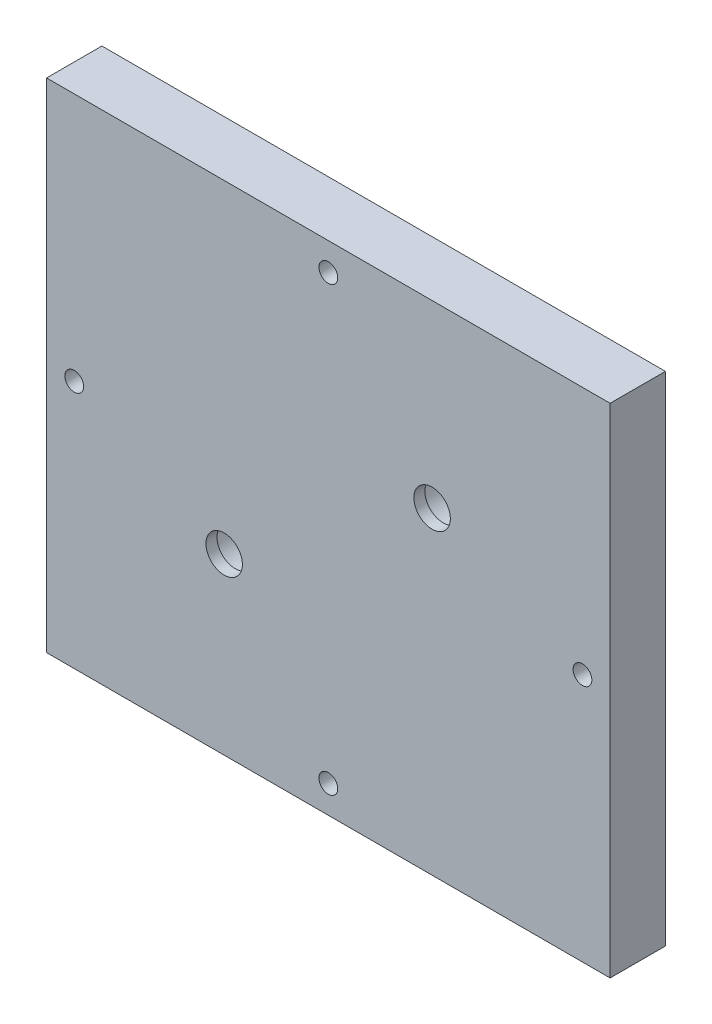
ISO-10303-21;
HEADER;
FILE_DESCRIPTION(('STEP AP214'),'2;1');
FILE_NAME('part.step','',(''),(''),'','','');
FILE_SCHEMA(('AUTOMOTIVE_DESIGN { 1 0 10303 214 1 1 1 1 }'));
ENDSEC;
DATA;
#1=APPLICATION_CONTEXT('core data for automotive mechanical design processes');
#2=APPLICATION_PROTOCOL_DEFINITION('international standard','automotive_design',2000,#1);
#3=PRODUCT_CONTEXT('',#1,'mechanical');
#4=PRODUCT('Part','Part','',(#3));
#5=PRODUCT_RELATED_PRODUCT_CATEGORY('part','',(#4));
#6=PRODUCT_DEFINITION_FORMATION('','',#4);
#7=PRODUCT_DEFINITION_CONTEXT('part definition',#1,'design');
#8=PRODUCT_DEFINITION('design','',#6,#7);
#9=PRODUCT_DEFINITION_SHAPE('','',#8);
#10=(LENGTH_UNIT() NAMED_UNIT(*) SI_UNIT(.MILLI.,.METRE.));
#11=(NAMED_UNIT(*) PLANE_ANGLE_UNIT() SI_UNIT($,.RADIAN.));
#12=(NAMED_UNIT(*) SI_UNIT($,.STERADIAN.) SOLID_ANGLE_UNIT());
#13=UNCERTAINTY_MEASURE_WITH_UNIT(LENGTH_MEASURE(1.E-05),#10,'distance_accuracy_value','');
#14=(GEOMETRIC_REPRESENTATION_CONTEXT(3) GLOBAL_UNCERTAINTY_ASSIGNED_CONTEXT((#13)) GLOBAL_UNIT_ASSIGNED_CONTEXT((#10,
#11,#12)) REPRESENTATION_CONTEXT('',''));
#15=CARTESIAN_POINT('',(0.,0.,0.));
#16=DIRECTION('',(0.,0.,1.));
#17=DIRECTION('',(1.,0.,0.));
#18=AXIS2_PLACEMENT_3D('',#15,#16,#17);
#19=CARTESIAN_POINT('',(45.9632415614786,58.8506318262794,-13.3350359577631));
#20=DIRECTION('',(-1.,0.,0.));
#21=DIRECTION('',(0.,-1.,0.));
#22=AXIS2_PLACEMENT_3D('',#19,#20,#21);
#23=PLANE('',#22);
#24=DIRECTION('',(0.,1.,0.));
#25=VECTOR('',#24,1.);
#26=CARTESIAN_POINT('',(45.9632415614786,58.8506318262794,-23.3350359577631));
#27=LINE('',#26,#25);
#28=CARTESIAN_POINT('',(45.9632415614786,-31.1493681737206,-23.3350359577631));
#29=VERTEX_POINT('',#28);
#30=CARTESIAN_POINT('',(45.9632415614786,58.8506318262794,-23.3350359577631));
#31=VERTEX_POINT('',#30);
#32=EDGE_CURVE('E94',#29,#31,#27,.T.);
#33=ORIENTED_EDGE('',*,*,#32,.T.);
#34=DIRECTION('',(0.,0.,-1.));
#35=VECTOR('',#34,1.);
#36=CARTESIAN_POINT('',(45.9632415614786,58.8506318262794,-13.3350359577631));
#37=LINE('',#36,#35);
#38=CARTESIAN_POINT('',(45.9632415614786,58.8506318262794,-13.3350359577631));
#39=VERTEX_POINT('',#38);
#40=EDGE_CURVE('E11',#39,#31,#37,.T.);
#41=ORIENTED_EDGE('',*,*,#40,.F.);
#42=DIRECTION('',(0.,1.,0.));
#43=VECTOR('',#42,1.);
#44=CARTESIAN_POINT('',(45.9632415614786,58.8506318262794,-13.3350359577631));
#45=LINE('',#44,#43);
#46=CARTESIAN_POINT('',(45.9632415614786,-31.1493681737206,-13.3350359577631));
#47=VERTEX_POINT('',#46);
#48=EDGE_CURVE('E82',#47,#39,#45,.T.);
#49=ORIENTED_EDGE('',*,*,#48,.F.);
#50=DIRECTION('',(0.,0.,-1.));
#51=VECTOR('',#50,1.);
#52=CARTESIAN_POINT('',(45.9632415614786,-31.1493681737206,-13.3350359577631));
#53=LINE('',#52,#51);
#54=EDGE_CURVE('E90',#47,#29,#53,.T.);
#55=ORIENTED_EDGE('',*,*,#54,.T.);
#56=EDGE_LOOP('',(#33,#41,#49,#55));
#57=FACE_BOUND('',#56,.T.);
#58=ADVANCED_FACE('F31',(#57),#23,.F.);
#59=CARTESIAN_POINT('',(45.9632415614786,58.8506318262794,-13.3350359577631));
#60=DIRECTION('',(0.,-1.,0.));
#61=DIRECTION('',(1.,0.,0.));
#62=AXIS2_PLACEMENT_3D('',#59,#60,#61);
#63=PLANE('',#62);
#64=DIRECTION('',(-1.,0.,0.));
#65=VECTOR('',#64,1.);
#66=CARTESIAN_POINT('',(45.9632415614786,58.8506318262794,-23.3350359577631));
#67=LINE('',#66,#65);
#68=CARTESIAN_POINT('',(-55.9367584385214,58.8506318262794,-23.3350359577631));
#69=VERTEX_POINT('',#68);
#70=EDGE_CURVE('E86',#31,#69,#67,.T.);
#71=ORIENTED_EDGE('',*,*,#70,.T.);
#72=DIRECTION('',(0.,0.,-1.));
#73=VECTOR('',#72,1.);
#74=CARTESIAN_POINT('',(-55.9367584385214,58.8506318262794,-13.3350359577631));
#75=LINE('',#74,#73);
#76=CARTESIAN_POINT('',(-55.9367584385214,58.8506318262794,-13.3350359577631));
#77=VERTEX_POINT('',#76);
#78=EDGE_CURVE('E39',#77,#69,#75,.T.);
#79=ORIENTED_EDGE('',*,*,#78,.F.);
#80=DIRECTION('',(-1.,0.,0.));
#81=VECTOR('',#80,1.);
#82=CARTESIAN_POINT('',(45.9632415614786,58.8506318262794,-13.3350359577631));
#83=LINE('',#82,#81);
#84=EDGE_CURVE('E77',#39,#77,#83,.T.);
#85=ORIENTED_EDGE('',*,*,#84,.F.);
#86=ORIENTED_EDGE('',*,*,#40,.T.);
#87=EDGE_LOOP('',(#71,#79,#85,#86));
#88=FACE_BOUND('',#87,.T.);
#89=ADVANCED_FACE('F85',(#88),#63,.F.);
#90=CARTESIAN_POINT('',(-55.9367584385214,58.8506318262794,-13.3350359577631));
#91=DIRECTION('',(1.,0.,0.));
#92=DIRECTION('',(0.,1.,0.));
#93=AXIS2_PLACEMENT_3D('',#90,#91,#92);
#94=PLANE('',#93);
#95=DIRECTION('',(0.,-1.,0.));
#96=VECTOR('',#95,1.);
#97=CARTESIAN_POINT('',(-55.9367584385214,58.8506318262794,-23.3350359577631));
#98=LINE('',#97,#96);
#99=CARTESIAN_POINT('',(-55.9367584385214,-31.1493681737206,-23.3350359577631));
#100=VERTEX_POINT('',#99);
#101=EDGE_CURVE('E64',#69,#100,#98,.T.);
#102=ORIENTED_EDGE('',*,*,#101,.T.);
#103=DIRECTION('',(0.,0.,-1.));
#104=VECTOR('',#103,1.);
#105=CARTESIAN_POINT('',(-55.9367584385214,-31.1493681737206,-13.3350359577631));
#106=LINE('',#105,#104);
#107=CARTESIAN_POINT('',(-55.9367584385214,-31.1493681737206,-13.3350359577631));
#108=VERTEX_POINT('',#107);
#109=EDGE_CURVE('E87',#108,#100,#106,.T.);
#110=ORIENTED_EDGE('',*,*,#109,.F.);
#111=DIRECTION('',(0.,-1.,0.));
#112=VECTOR('',#111,1.);
#113=CARTESIAN_POINT('',(-55.9367584385214,58.8506318262794,-13.3350359577631));
#114=LINE('',#113,#112);
#115=EDGE_CURVE('E80',#77,#108,#114,.T.);
#116=ORIENTED_EDGE('',*,*,#115,.F.);
#117=ORIENTED_EDGE('',*,*,#78,.T.);
#118=EDGE_LOOP('',(#102,#110,#116,#117));
#119=FACE_BOUND('',#118,.T.);
#120=ADVANCED_FACE('F88',(#119),#94,.F.);
#121=CARTESIAN_POINT('',(45.9632415614786,-31.1493681737206,-13.3350359577631));
#122=DIRECTION('',(0.,1.,0.));
#123=DIRECTION('',(-1.,0.,0.));
#124=AXIS2_PLACEMENT_3D('',#121,#122,#123);
#125=PLANE('',#124);
#126=DIRECTION('',(1.,0.,0.));
#127=VECTOR('',#126,1.);
#128=CARTESIAN_POINT('',(45.9632415614786,-31.1493681737206,-23.3350359577631));
#129=LINE('',#128,#127);
#130=EDGE_CURVE('E70',#100,#29,#129,.T.);
#131=ORIENTED_EDGE('',*,*,#130,.T.);
#132=ORIENTED_EDGE('',*,*,#54,.F.);
#133=DIRECTION('',(1.,0.,0.));
#134=VECTOR('',#133,1.);
#135=CARTESIAN_POINT('',(45.9632415614786,-31.1493681737206,-13.3350359577631));
#136=LINE('',#135,#134);
#137=EDGE_CURVE('E47',#108,#47,#136,.T.);
#138=ORIENTED_EDGE('',*,*,#137,.F.);
#139=ORIENTED_EDGE('',*,*,#109,.T.);
#140=EDGE_LOOP('',(#131,#132,#138,#139));
#141=FACE_BOUND('',#140,.T.);
#142=ADVANCED_FACE('F102',(#141),#125,.F.);
#143=CARTESIAN_POINT('',(45.9632415614786,-31.1493681737206,-13.3350359577631));
#144=DIRECTION('',(0.,0.,-1.));
#145=DIRECTION('',(-1.,0.,0.));
#146=AXIS2_PLACEMENT_3D('',#143,#144,#145);
#147=PLANE('',#146);
#148=CARTESIAN_POINT('',(13.7732415614786,26.3306318262794,-13.3350359577631));
#149=DIRECTION('',(0.,0.,-1.));
#150=DIRECTION('',(-1.,0.,0.));
#151=AXIS2_PLACEMENT_3D('',#148,#149,#150);
#152=CIRCLE('',#151,3.29999999999999);
#153=CARTESIAN_POINT('',(10.4732415614786,26.3306318262794,-13.3350359577631));
#154=VERTEX_POINT('',#153);
#155=EDGE_CURVE('E149',#154,#154,#152,.T.);
#156=ORIENTED_EDGE('',*,*,#155,.T.);
#157=EDGE_LOOP('',(#156));
#158=FACE_BOUND('',#157,.T.);
#159=CARTESIAN_POINT('',(-23.8267584385214,0.350631826279403,-13.3350359577631));
#160=DIRECTION('',(0.,0.,-1.));
#161=DIRECTION('',(-1.,0.,0.));
#162=AXIS2_PLACEMENT_3D('',#159,#160,#161);
#163=CIRCLE('',#162,3.29999999999999);
#164=CARTESIAN_POINT('',(-27.1267584385214,0.350631826279403,-13.3350359577631));
#165=VERTEX_POINT('',#164);
#166=EDGE_CURVE('E141',#165,#165,#163,.T.);
#167=ORIENTED_EDGE('',*,*,#166,.T.);
#168=EDGE_LOOP('',(#167));
#169=FACE_BOUND('',#168,.T.);
#170=CARTESIAN_POINT('',(40.9632415614786,13.8506318262794,-13.3350359577631));
#171=DIRECTION('',(0.,0.,-1.));
#172=DIRECTION('',(-1.,0.,0.));
#173=AXIS2_PLACEMENT_3D('',#170,#171,#172);
#174=CIRCLE('',#173,1.69999999999999);
#175=CARTESIAN_POINT('',(39.2632415614786,13.8506318262794,-13.3350359577631));
#176=VERTEX_POINT('',#175);
#177=EDGE_CURVE('E125',#176,#176,#174,.T.);
#178=ORIENTED_EDGE('',*,*,#177,.T.);
#179=EDGE_LOOP('',(#178));
#180=FACE_BOUND('',#179,.T.);
#181=CARTESIAN_POINT('',(-4.98675843852144,53.8506318262794,-13.3350359577631));
#182=DIRECTION('',(0.,0.,-1.));
#183=DIRECTION('',(-1.,0.,0.));
#184=AXIS2_PLACEMENT_3D('',#181,#182,#183);
#185=CIRCLE('',#184,1.69999999999999);
#186=CARTESIAN_POINT('',(-6.68675843852143,53.8506318262794,-13.3350359577631));
#187=VERTEX_POINT('',#186);
#188=EDGE_CURVE('E119',#187,#187,#185,.T.);
#189=ORIENTED_EDGE('',*,*,#188,.T.);
#190=EDGE_LOOP('',(#189));
#191=FACE_BOUND('',#190,.T.);
#192=CARTESIAN_POINT('',(-50.9367584385215,13.8506318262794,-13.3350359577631));
#193=DIRECTION('',(0.,0.,-1.));
#194=DIRECTION('',(-1.,0.,0.));
#195=AXIS2_PLACEMENT_3D('',#192,#193,#194);
#196=CIRCLE('',#195,1.69999999999999);
#197=CARTESIAN_POINT('',(-52.6367584385214,13.8506318262794,-13.3350359577631));
#198=VERTEX_POINT('',#197);
#199=EDGE_CURVE('E113',#198,#198,#196,.T.);
#200=ORIENTED_EDGE('',*,*,#199,.T.);
#201=EDGE_LOOP('',(#200));
#202=FACE_BOUND('',#201,.T.);
#203=CARTESIAN_POINT('',(-4.98675843852144,-26.1493681737206,-13.3350359577631));
#204=DIRECTION('',(0.,0.,-1.));
#205=DIRECTION('',(-1.,0.,0.));
#206=AXIS2_PLACEMENT_3D('',#203,#204,#205);
#207=CIRCLE('',#206,1.69999999999999);
#208=CARTESIAN_POINT('',(-6.68675843852143,-26.1493681737206,-13.3350359577631));
#209=VERTEX_POINT('',#208);
#210=EDGE_CURVE('E97',#209,#209,#207,.T.);
#211=ORIENTED_EDGE('',*,*,#210,.T.);
#212=EDGE_LOOP('',(#211));
#213=FACE_BOUND('',#212,.T.);
#214=ORIENTED_EDGE('',*,*,#48,.T.);
#215=ORIENTED_EDGE('',*,*,#84,.T.);
#216=ORIENTED_EDGE('',*,*,#115,.T.);
#217=ORIENTED_EDGE('',*,*,#137,.T.);
#218=EDGE_LOOP('',(#214,#215,#216,#217));
#219=FACE_BOUND('',#218,.T.);
#220=ADVANCED_FACE('F78',(#158,#169,#180,#191,#202,#213,#219),#147,.F.);
#221=CARTESIAN_POINT('',(45.9632415614786,-31.1493681737206,-23.3350359577631));
#222=DIRECTION('',(0.,0.,-1.));
#223=DIRECTION('',(-1.,0.,0.));
#224=AXIS2_PLACEMENT_3D('',#221,#222,#223);
#225=PLANE('',#224);
#226=CARTESIAN_POINT('',(-23.8267584385214,0.350631826279403,-23.3350359577631));
#227=DIRECTION('',(0.,0.,-1.));
#228=DIRECTION('',(-1.,0.,0.));
#229=AXIS2_PLACEMENT_3D('',#226,#227,#228);
#230=CIRCLE('',#229,4.99999999999631);
#231=CARTESIAN_POINT('',(-28.8267584385177,0.350631826279403,-23.3350359577631));
#232=VERTEX_POINT('',#231);
#233=EDGE_CURVE('E138',#232,#232,#230,.T.);
#234=ORIENTED_EDGE('',*,*,#233,.F.);
#235=EDGE_LOOP('',(#234));
#236=FACE_BOUND('',#235,.T.);
#237=CARTESIAN_POINT('',(13.7732415614786,26.3306318262794,-23.3350359577631));
#238=DIRECTION('',(0.,0.,-1.));
#239=DIRECTION('',(-1.,0.,0.));
#240=AXIS2_PLACEMENT_3D('',#237,#238,#239);
#241=CIRCLE('',#240,4.9999999999963);
#242=CARTESIAN_POINT('',(8.77324156148228,26.3306318262794,-23.3350359577631));
#243=VERTEX_POINT('',#242);
#244=EDGE_CURVE('E132',#243,#243,#241,.T.);
#245=ORIENTED_EDGE('',*,*,#244,.F.);
#246=EDGE_LOOP('',(#245));
#247=FACE_BOUND('',#246,.T.);
#248=CARTESIAN_POINT('',(40.9632415614786,13.8506318262794,-23.3350359577631));
#249=DIRECTION('',(0.,0.,-1.));
#250=DIRECTION('',(-1.,0.,0.));
#251=AXIS2_PLACEMENT_3D('',#248,#249,#250);
#252=CIRCLE('',#251,1.69999999999999);
#253=CARTESIAN_POINT('',(39.2632415614786,13.8506318262794,-23.3350359577631));
#254=VERTEX_POINT('',#253);
#255=EDGE_CURVE('E128',#254,#254,#252,.T.);
#256=ORIENTED_EDGE('',*,*,#255,.F.);
#257=EDGE_LOOP('',(#256));
#258=FACE_BOUND('',#257,.T.);
#259=CARTESIAN_POINT('',(-4.98675843852144,53.8506318262794,-23.3350359577631));
#260=DIRECTION('',(0.,0.,-1.));
#261=DIRECTION('',(-1.,0.,0.));
#262=AXIS2_PLACEMENT_3D('',#259,#260,#261);
#263=CIRCLE('',#262,1.69999999999999);
#264=CARTESIAN_POINT('',(-6.68675843852142,53.8506318262794,-23.3350359577631));
#265=VERTEX_POINT('',#264);
#266=EDGE_CURVE('E122',#265,#265,#263,.T.);
#267=ORIENTED_EDGE('',*,*,#266,.F.);
#268=EDGE_LOOP('',(#267));
#269=FACE_BOUND('',#268,.T.);
#270=CARTESIAN_POINT('',(-50.9367584385215,13.8506318262794,-23.3350359577631));
#271=DIRECTION('',(0.,0.,-1.));
#272=DIRECTION('',(-1.,0.,0.));
#273=AXIS2_PLACEMENT_3D('',#270,#271,#272);
#274=CIRCLE('',#273,1.69999999999999);
#275=CARTESIAN_POINT('',(-52.6367584385214,13.8506318262794,-23.3350359577631));
#276=VERTEX_POINT('',#275);
#277=EDGE_CURVE('E116',#276,#276,#274,.T.);
#278=ORIENTED_EDGE('',*,*,#277,.F.);
#279=EDGE_LOOP('',(#278));
#280=FACE_BOUND('',#279,.T.);
#281=CARTESIAN_POINT('',(-4.98675843852144,-26.1493681737206,-23.3350359577631));
#282=DIRECTION('',(0.,0.,-1.));
#283=DIRECTION('',(-1.,0.,0.));
#284=AXIS2_PLACEMENT_3D('',#281,#282,#283);
#285=CIRCLE('',#284,1.69999999999999);
#286=CARTESIAN_POINT('',(-6.68675843852142,-26.1493681737206,-23.3350359577631));
#287=VERTEX_POINT('',#286);
#288=EDGE_CURVE('E110',#287,#287,#285,.T.);
#289=ORIENTED_EDGE('',*,*,#288,.F.);
#290=EDGE_LOOP('',(#289));
#291=FACE_BOUND('',#290,.T.);
#292=ORIENTED_EDGE('',*,*,#32,.F.);
#293=ORIENTED_EDGE('',*,*,#130,.F.);
#294=ORIENTED_EDGE('',*,*,#101,.F.);
#295=ORIENTED_EDGE('',*,*,#70,.F.);
#296=EDGE_LOOP('',(#292,#293,#294,#295));
#297=FACE_BOUND('',#296,.T.);
#298=ADVANCED_FACE('F105',(#236,#247,#258,#269,#280,#291,#297),#225,.T.);
#299=CARTESIAN_POINT('',(-4.98675843852144,-26.1493681737206,-23.3350359577631));
#300=DIRECTION('',(0.,0.,-1.));
#301=DIRECTION('',(-1.,0.,0.));
#302=AXIS2_PLACEMENT_3D('',#299,#300,#301);
#303=CYLINDRICAL_SURFACE('',#302,1.69999999999999);
#304=ORIENTED_EDGE('',*,*,#210,.F.);
#305=EDGE_LOOP('',(#304));
#306=FACE_BOUND('',#305,.T.);
#307=ORIENTED_EDGE('',*,*,#288,.T.);
#308=EDGE_LOOP('',(#307));
#309=FACE_BOUND('',#308,.T.);
#310=ADVANCED_FACE('F174',(#306,#309),#303,.F.);
#311=CARTESIAN_POINT('',(-50.9367584385215,13.8506318262794,-23.3350359577631));
#312=DIRECTION('',(0.,0.,-1.));
#313=DIRECTION('',(-1.,0.,0.));
#314=AXIS2_PLACEMENT_3D('',#311,#312,#313);
#315=CYLINDRICAL_SURFACE('',#314,1.69999999999999);
#316=ORIENTED_EDGE('',*,*,#199,.F.);
#317=EDGE_LOOP('',(#316));
#318=FACE_BOUND('',#317,.T.);
#319=ORIENTED_EDGE('',*,*,#277,.T.);
#320=EDGE_LOOP('',(#319));
#321=FACE_BOUND('',#320,.T.);
#322=ADVANCED_FACE('F186',(#318,#321),#315,.F.);
#323=CARTESIAN_POINT('',(-4.98675843852144,53.8506318262794,-23.3350359577631));
#324=DIRECTION('',(0.,0.,-1.));
#325=DIRECTION('',(-1.,0.,0.));
#326=AXIS2_PLACEMENT_3D('',#323,#324,#325);
#327=CYLINDRICAL_SURFACE('',#326,1.69999999999999);
#328=ORIENTED_EDGE('',*,*,#188,.F.);
#329=EDGE_LOOP('',(#328));
#330=FACE_BOUND('',#329,.T.);
#331=ORIENTED_EDGE('',*,*,#266,.T.);
#332=EDGE_LOOP('',(#331));
#333=FACE_BOUND('',#332,.T.);
#334=ADVANCED_FACE('F192',(#330,#333),#327,.F.);
#335=CARTESIAN_POINT('',(40.9632415614786,13.8506318262794,-23.3350359577631));
#336=DIRECTION('',(0.,0.,-1.));
#337=DIRECTION('',(-1.,0.,0.));
#338=AXIS2_PLACEMENT_3D('',#335,#336,#337);
#339=CYLINDRICAL_SURFACE('',#338,1.69999999999999);
#340=ORIENTED_EDGE('',*,*,#177,.F.);
#341=EDGE_LOOP('',(#340));
#342=FACE_BOUND('',#341,.T.);
#343=ORIENTED_EDGE('',*,*,#255,.T.);
#344=EDGE_LOOP('',(#343));
#345=FACE_BOUND('',#344,.T.);
#346=ADVANCED_FACE('F168',(#342,#345),#339,.F.);
#347=CARTESIAN_POINT('',(13.7732415614786,26.3306318262794,-15.3350359577631));
#348=DIRECTION('',(0.,0.,-1.));
#349=DIRECTION('',(-1.,0.,0.));
#350=AXIS2_PLACEMENT_3D('',#347,#348,#349);
#351=CYLINDRICAL_SURFACE('',#350,4.9999999999963);
#352=CARTESIAN_POINT('',(13.7732415614786,26.3306318262794,-15.3350359577631));
#353=DIRECTION('',(0.,0.,-1.));
#354=DIRECTION('',(-1.,0.,0.));
#355=AXIS2_PLACEMENT_3D('',#352,#353,#354);
#356=CIRCLE('',#355,4.9999999999963);
#357=CARTESIAN_POINT('',(8.77324156148228,26.3306318262794,-15.3350359577631));
#358=VERTEX_POINT('',#357);
#359=EDGE_CURVE('E131',#358,#358,#356,.T.);
#360=ORIENTED_EDGE('',*,*,#359,.F.);
#361=EDGE_LOOP('',(#360));
#362=FACE_BOUND('',#361,.T.);
#363=ORIENTED_EDGE('',*,*,#244,.T.);
#364=EDGE_LOOP('',(#363));
#365=FACE_BOUND('',#364,.T.);
#366=ADVANCED_FACE('F162',(#362,#365),#351,.F.);
#367=CARTESIAN_POINT('',(13.7732415614786,26.3306318262794,-15.3350359577631));
#368=DIRECTION('',(0.,0.,-1.));
#369=DIRECTION('',(-1.,0.,0.));
#370=AXIS2_PLACEMENT_3D('',#367,#368,#369);
#371=PLANE('',#370);
#372=CARTESIAN_POINT('',(13.7732415614786,26.3306318262794,-15.3350359577631));
#373=DIRECTION('',(0.,0.,-1.));
#374=DIRECTION('',(-1.,0.,0.));
#375=AXIS2_PLACEMENT_3D('',#372,#373,#374);
#376=CIRCLE('',#375,3.29999999999999);
#377=CARTESIAN_POINT('',(10.4732415614786,26.3306318262794,-15.3350359577631));
#378=VERTEX_POINT('',#377);
#379=EDGE_CURVE('E152',#378,#378,#376,.T.);
#380=ORIENTED_EDGE('',*,*,#379,.F.);
#381=EDGE_LOOP('',(#380));
#382=FACE_BOUND('',#381,.T.);
#383=ORIENTED_EDGE('',*,*,#359,.T.);
#384=EDGE_LOOP('',(#383));
#385=FACE_BOUND('',#384,.T.);
#386=ADVANCED_FACE('F158',(#382,#385),#371,.T.);
#387=CARTESIAN_POINT('',(-23.8267584385214,0.350631826279403,-15.3350359577631));
#388=DIRECTION('',(0.,0.,-1.));
#389=DIRECTION('',(-1.,0.,0.));
#390=AXIS2_PLACEMENT_3D('',#387,#388,#389);
#391=CYLINDRICAL_SURFACE('',#390,4.99999999999631);
#392=CARTESIAN_POINT('',(-23.8267584385214,0.350631826279403,-15.3350359577631));
#393=DIRECTION('',(0.,0.,-1.));
#394=DIRECTION('',(-1.,0.,0.));
#395=AXIS2_PLACEMENT_3D('',#392,#393,#394);
#396=CIRCLE('',#395,4.99999999999631);
#397=CARTESIAN_POINT('',(-28.8267584385177,0.350631826279403,-15.3350359577631));
#398=VERTEX_POINT('',#397);
#399=EDGE_CURVE('E135',#398,#398,#396,.T.);
#400=ORIENTED_EDGE('',*,*,#399,.F.);
#401=EDGE_LOOP('',(#400));
#402=FACE_BOUND('',#401,.T.);
#403=ORIENTED_EDGE('',*,*,#233,.T.);
#404=EDGE_LOOP('',(#403));
#405=FACE_BOUND('',#404,.T.);
#406=ADVANCED_FACE('F161',(#402,#405),#391,.F.);
#407=CARTESIAN_POINT('',(-23.8267584385214,0.350631826279403,-15.3350359577631));
#408=DIRECTION('',(0.,0.,-1.));
#409=DIRECTION('',(-1.,0.,0.));
#410=AXIS2_PLACEMENT_3D('',#407,#408,#409);
#411=PLANE('',#410);
#412=CARTESIAN_POINT('',(-23.8267584385214,0.350631826279403,-15.3350359577631));
#413=DIRECTION('',(0.,0.,-1.));
#414=DIRECTION('',(-1.,0.,0.));
#415=AXIS2_PLACEMENT_3D('',#412,#413,#414);
#416=CIRCLE('',#415,3.29999999999999);
#417=CARTESIAN_POINT('',(-27.1267584385214,0.350631826279403,-15.3350359577631));
#418=VERTEX_POINT('',#417);
#419=EDGE_CURVE('E146',#418,#418,#416,.T.);
#420=ORIENTED_EDGE('',*,*,#419,.F.);
#421=EDGE_LOOP('',(#420));
#422=FACE_BOUND('',#421,.T.);
#423=ORIENTED_EDGE('',*,*,#399,.T.);
#424=EDGE_LOOP('',(#423));
#425=FACE_BOUND('',#424,.T.);
#426=ADVANCED_FACE('F234',(#422,#425),#411,.T.);
#427=CARTESIAN_POINT('',(-23.8267584385214,0.350631826279403,-15.3350359577631));
#428=DIRECTION('',(0.,0.,-1.));
#429=DIRECTION('',(-1.,0.,0.));
#430=AXIS2_PLACEMENT_3D('',#427,#428,#429);
#431=CYLINDRICAL_SURFACE('',#430,3.29999999999999);
#432=ORIENTED_EDGE('',*,*,#166,.F.);
#433=EDGE_LOOP('',(#432));
#434=FACE_BOUND('',#433,.T.);
#435=ORIENTED_EDGE('',*,*,#419,.T.);
#436=EDGE_LOOP('',(#435));
#437=FACE_BOUND('',#436,.T.);
#438=ADVANCED_FACE('F238',(#434,#437),#431,.F.);
#439=CARTESIAN_POINT('',(13.7732415614786,26.3306318262794,-15.3350359577631));
#440=DIRECTION('',(0.,0.,-1.));
#441=DIRECTION('',(-1.,0.,0.));
#442=AXIS2_PLACEMENT_3D('',#439,#440,#441);
#443=CYLINDRICAL_SURFACE('',#442,3.29999999999999);
#444=ORIENTED_EDGE('',*,*,#155,.F.);
#445=EDGE_LOOP('',(#444));
#446=FACE_BOUND('',#445,.T.);
#447=ORIENTED_EDGE('',*,*,#379,.T.);
#448=EDGE_LOOP('',(#447));
#449=FACE_BOUND('',#448,.T.);
#450=ADVANCED_FACE('F156',(#446,#449),#443,.F.);
#451=CLOSED_SHELL('',(#58,#89,#120,#142,#220,#298,#310,#322,#334,#346,#366,#386,#406,#426,#438,#450));
#452=MANIFOLD_SOLID_BREP('B2',#451);
#453=ADVANCED_BREP_SHAPE_REPRESENTATION('',(#18,#452),#14);
#454=SHAPE_DEFINITION_REPRESENTATION(#9,#453);
ENDSEC;
END-ISO-10303-21;
